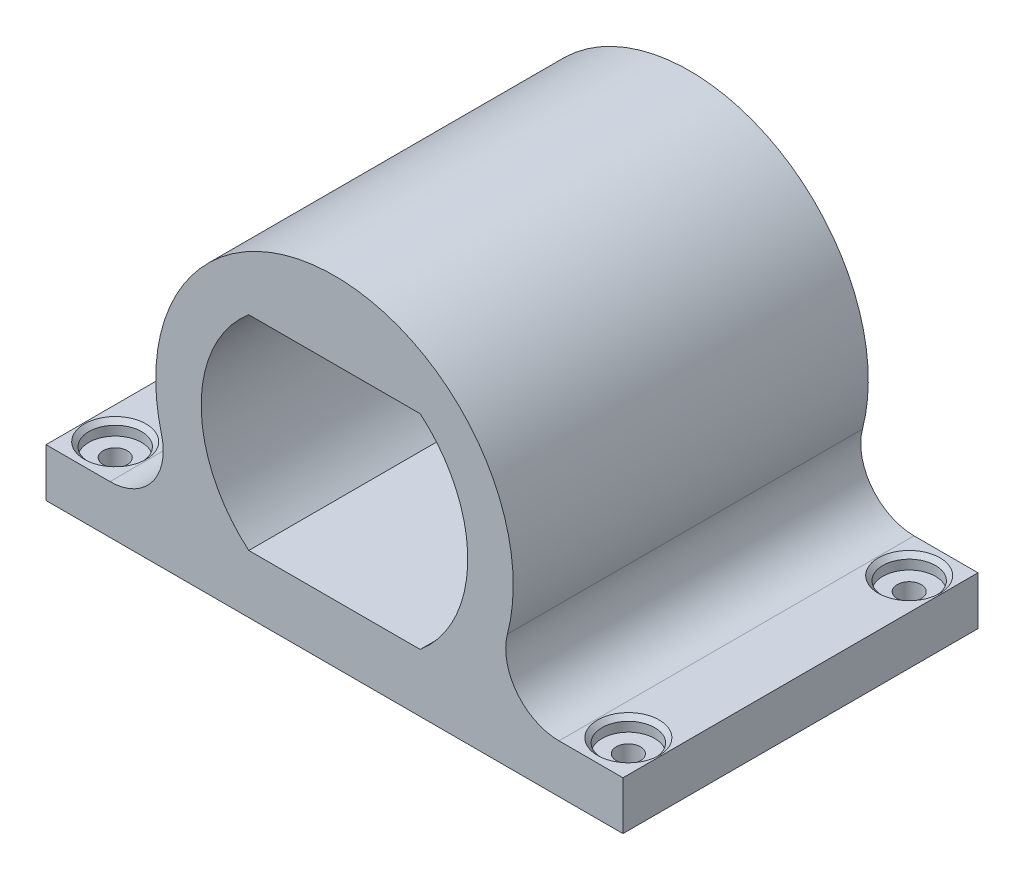
ISO-10303-21;
HEADER;
FILE_DESCRIPTION(('STEP AP214'),'2;1');
FILE_NAME('part.step','',(''),(''),'','','');
FILE_SCHEMA(('AUTOMOTIVE_DESIGN { 1 0 10303 214 1 1 1 1 }'));
ENDSEC;
DATA;
#1=APPLICATION_CONTEXT('core data for automotive mechanical design processes');
#2=APPLICATION_PROTOCOL_DEFINITION('international standard','automotive_design',2000,#1);
#3=PRODUCT_CONTEXT('',#1,'mechanical');
#4=PRODUCT('Part','Part','',(#3));
#5=PRODUCT_RELATED_PRODUCT_CATEGORY('part','',(#4));
#6=PRODUCT_DEFINITION_FORMATION('','',#4);
#7=PRODUCT_DEFINITION_CONTEXT('part definition',#1,'design');
#8=PRODUCT_DEFINITION('design','',#6,#7);
#9=PRODUCT_DEFINITION_SHAPE('','',#8);
#10=(LENGTH_UNIT() NAMED_UNIT(*) SI_UNIT(.MILLI.,.METRE.));
#11=(NAMED_UNIT(*) PLANE_ANGLE_UNIT() SI_UNIT($,.RADIAN.));
#12=(NAMED_UNIT(*) SI_UNIT($,.STERADIAN.) SOLID_ANGLE_UNIT());
#13=UNCERTAINTY_MEASURE_WITH_UNIT(LENGTH_MEASURE(1.E-05),#10,'distance_accuracy_value','');
#14=(GEOMETRIC_REPRESENTATION_CONTEXT(3) GLOBAL_UNCERTAINTY_ASSIGNED_CONTEXT((#13)) GLOBAL_UNIT_ASSIGNED_CONTEXT((#10,
#11,#12)) REPRESENTATION_CONTEXT('',''));
#15=CARTESIAN_POINT('',(0.,0.,0.));
#16=DIRECTION('',(0.,0.,1.));
#17=DIRECTION('',(1.,0.,0.));
#18=AXIS2_PLACEMENT_3D('',#15,#16,#17);
#19=CARTESIAN_POINT('',(-32.1204465765012,-8.38020267021273,50.8));
#20=DIRECTION('',(0.,0.,1.));
#21=DIRECTION('',(1.,0.,0.));
#22=AXIS2_PLACEMENT_3D('',#19,#20,#21);
#23=PLANE('',#22);
#24=CARTESIAN_POINT('',(-32.1204465765012,-8.38020267021273,50.8));
#25=DIRECTION('',(0.,0.,-1.));
#26=DIRECTION('',(1.,0.,0.));
#27=AXIS2_PLACEMENT_3D('',#24,#25,#26);
#28=CIRCLE('',#27,7.62);
#29=CARTESIAN_POINT('',(-24.7472565486679,-6.45654240564971,50.8));
#30=VERTEX_POINT('',#29);
#31=CARTESIAN_POINT('',(-32.1204465765012,-16.0002026702127,50.8));
#32=VERTEX_POINT('',#31);
#33=EDGE_CURVE('E162',#30,#32,#28,.T.);
#34=ORIENTED_EDGE('',*,*,#33,.T.);
#35=DIRECTION('',(-1.,0.,0.));
#36=VECTOR('',#35,1.);
#37=CARTESIAN_POINT('',(-41.275,-16.0002026702127,50.8));
#38=LINE('',#37,#36);
#39=CARTESIAN_POINT('',(-41.275,-16.0002026702127,50.8));
#40=VERTEX_POINT('',#39);
#41=EDGE_CURVE('E165',#32,#40,#38,.T.);
#42=ORIENTED_EDGE('',*,*,#41,.T.);
#43=DIRECTION('',(0.,-1.,0.));
#44=VECTOR('',#43,1.);
#45=CARTESIAN_POINT('',(-41.275,-22.9235,50.8));
#46=LINE('',#45,#44);
#47=CARTESIAN_POINT('',(-41.275,-22.9235,50.8));
#48=VERTEX_POINT('',#47);
#49=EDGE_CURVE('E168',#40,#48,#46,.T.);
#50=ORIENTED_EDGE('',*,*,#49,.T.);
#51=DIRECTION('',(1.,0.,0.));
#52=VECTOR('',#51,1.);
#53=CARTESIAN_POINT('',(41.275,-22.9235,50.8));
#54=LINE('',#53,#52);
#55=CARTESIAN_POINT('',(41.275,-22.9235,50.8));
#56=VERTEX_POINT('',#55);
#57=EDGE_CURVE('E170',#48,#56,#54,.T.);
#58=ORIENTED_EDGE('',*,*,#57,.T.);
#59=DIRECTION('',(0.,1.,0.));
#60=VECTOR('',#59,1.);
#61=CARTESIAN_POINT('',(41.275,-15.9999095174357,50.8));
#62=LINE('',#61,#60);
#63=CARTESIAN_POINT('',(41.275,-15.9999095174357,50.8));
#64=VERTEX_POINT('',#63);
#65=EDGE_CURVE('E172',#56,#64,#62,.T.);
#66=ORIENTED_EDGE('',*,*,#65,.T.);
#67=DIRECTION('',(-0.999999999487262,-3.20230458404112E-05,0.));
#68=VECTOR('',#67,1.);
#69=CARTESIAN_POINT('',(41.275,-15.9999095174357,50.8));
#70=LINE('',#69,#68);
#71=CARTESIAN_POINT('',(32.1206905921105,-16.0002026663057,50.8));
#72=VERTEX_POINT('',#71);
#73=EDGE_CURVE('E174',#64,#72,#70,.T.);
#74=ORIENTED_EDGE('',*,*,#73,.T.);
#75=CARTESIAN_POINT('',(32.1204465765012,-8.38020267021273,50.8));
#76=DIRECTION('',(0.,0.,-1.));
#77=DIRECTION('',(-1.,0.,0.));
#78=AXIS2_PLACEMENT_3D('',#75,#76,#77);
#79=CIRCLE('',#78,7.62);
#80=CARTESIAN_POINT('',(24.7472565486679,-6.45654240564969,50.8));
#81=VERTEX_POINT('',#80);
#82=EDGE_CURVE('E176',#72,#81,#79,.T.);
#83=ORIENTED_EDGE('',*,*,#82,.T.);
#84=CARTESIAN_POINT('',(0.,0.,50.8));
#85=DIRECTION('',(0.,0.,1.));
#86=DIRECTION('',(-1.,0.,0.));
#87=AXIS2_PLACEMENT_3D('',#84,#85,#86);
#88=CIRCLE('',#87,25.5756455738958);
#89=EDGE_CURVE('E178',#81,#30,#88,.T.);
#90=ORIENTED_EDGE('',*,*,#89,.T.);
#91=EDGE_LOOP('',(#34,#42,#50,#58,#66,#74,#83,#90));
#92=FACE_BOUND('',#91,.T.);
#93=DIRECTION('',(-1.,0.,0.));
#94=VECTOR('',#93,1.);
#95=CARTESIAN_POINT('',(0.,14.605,50.8));
#96=LINE('',#95,#94);
#97=CARTESIAN_POINT('',(12.2621960337946,14.605,50.8));
#98=VERTEX_POINT('',#97);
#99=CARTESIAN_POINT('',(-12.2621960337946,14.605,50.8));
#100=VERTEX_POINT('',#99);
#101=EDGE_CURVE('E132',#98,#100,#96,.T.);
#102=ORIENTED_EDGE('',*,*,#101,.F.);
#103=CARTESIAN_POINT('',(0.,0.,50.8));
#104=DIRECTION('',(0.,0.,1.));
#105=DIRECTION('',(-1.,0.,0.));
#106=AXIS2_PLACEMENT_3D('',#103,#104,#105);
#107=CIRCLE('',#106,19.0700675554967);
#108=CARTESIAN_POINT('',(12.2621960337946,-14.605,50.8));
#109=VERTEX_POINT('',#108);
#110=EDGE_CURVE('E124',#109,#98,#107,.T.);
#111=ORIENTED_EDGE('',*,*,#110,.F.);
#112=DIRECTION('',(1.,0.,0.));
#113=VECTOR('',#112,1.);
#114=CARTESIAN_POINT('',(0.,-14.605,50.8));
#115=LINE('',#114,#113);
#116=CARTESIAN_POINT('',(-12.2621960337946,-14.605,50.8));
#117=VERTEX_POINT('',#116);
#118=EDGE_CURVE('E146',#117,#109,#115,.T.);
#119=ORIENTED_EDGE('',*,*,#118,.F.);
#120=CARTESIAN_POINT('',(0.,0.,50.8));
#121=DIRECTION('',(0.,0.,1.));
#122=DIRECTION('',(1.,0.,0.));
#123=AXIS2_PLACEMENT_3D('',#120,#121,#122);
#124=CIRCLE('',#123,19.0700675554967);
#125=EDGE_CURVE('E144',#100,#117,#124,.T.);
#126=ORIENTED_EDGE('',*,*,#125,.F.);
#127=EDGE_LOOP('',(#102,#111,#119,#126));
#128=FACE_BOUND('',#127,.T.);
#129=ADVANCED_FACE('F33',(#92,#128),#23,.T.);
#130=CARTESIAN_POINT('',(-32.1204465765012,-8.38020267021273,0.));
#131=DIRECTION('',(0.,0.,1.));
#132=DIRECTION('',(1.,0.,0.));
#133=AXIS2_PLACEMENT_3D('',#130,#131,#132);
#134=PLANE('',#133);
#135=CARTESIAN_POINT('',(-32.1204465765012,-8.38020267021273,0.));
#136=DIRECTION('',(0.,0.,-1.));
#137=DIRECTION('',(1.,0.,0.));
#138=AXIS2_PLACEMENT_3D('',#135,#136,#137);
#139=CIRCLE('',#138,7.62);
#140=CARTESIAN_POINT('',(-24.7472565486679,-6.45654240564971,0.));
#141=VERTEX_POINT('',#140);
#142=CARTESIAN_POINT('',(-32.1204465765012,-16.0002026702127,0.));
#143=VERTEX_POINT('',#142);
#144=EDGE_CURVE('E140',#141,#143,#139,.T.);
#145=ORIENTED_EDGE('',*,*,#144,.F.);
#146=CARTESIAN_POINT('',(0.,0.,0.));
#147=DIRECTION('',(0.,0.,1.));
#148=DIRECTION('',(-1.,0.,0.));
#149=AXIS2_PLACEMENT_3D('',#146,#147,#148);
#150=CIRCLE('',#149,25.5756455738958);
#151=CARTESIAN_POINT('',(24.7472565486679,-6.45654240564969,0.));
#152=VERTEX_POINT('',#151);
#153=EDGE_CURVE('E166',#152,#141,#150,.T.);
#154=ORIENTED_EDGE('',*,*,#153,.F.);
#155=CARTESIAN_POINT('',(32.1204465765012,-8.38020267021273,0.));
#156=DIRECTION('',(0.,0.,-1.));
#157=DIRECTION('',(-1.,0.,0.));
#158=AXIS2_PLACEMENT_3D('',#155,#156,#157);
#159=CIRCLE('',#158,7.62);
#160=CARTESIAN_POINT('',(32.1206905921105,-16.0002026663057,0.));
#161=VERTEX_POINT('',#160);
#162=EDGE_CURVE('E193',#161,#152,#159,.T.);
#163=ORIENTED_EDGE('',*,*,#162,.F.);
#164=DIRECTION('',(-0.999999999487262,-3.20230458404112E-05,0.));
#165=VECTOR('',#164,1.);
#166=CARTESIAN_POINT('',(41.275,-15.9999095174357,0.));
#167=LINE('',#166,#165);
#168=CARTESIAN_POINT('',(41.275,-15.9999095174357,0.));
#169=VERTEX_POINT('',#168);
#170=EDGE_CURVE('E191',#169,#161,#167,.T.);
#171=ORIENTED_EDGE('',*,*,#170,.F.);
#172=DIRECTION('',(0.,1.,0.));
#173=VECTOR('',#172,1.);
#174=CARTESIAN_POINT('',(41.275,-15.9999095174357,0.));
#175=LINE('',#174,#173);
#176=CARTESIAN_POINT('',(41.275,-22.9235,0.));
#177=VERTEX_POINT('',#176);
#178=EDGE_CURVE('E189',#177,#169,#175,.T.);
#179=ORIENTED_EDGE('',*,*,#178,.F.);
#180=DIRECTION('',(1.,0.,0.));
#181=VECTOR('',#180,1.);
#182=CARTESIAN_POINT('',(41.275,-22.9235,0.));
#183=LINE('',#182,#181);
#184=CARTESIAN_POINT('',(-41.275,-22.9235,0.));
#185=VERTEX_POINT('',#184);
#186=EDGE_CURVE('E187',#185,#177,#183,.T.);
#187=ORIENTED_EDGE('',*,*,#186,.F.);
#188=DIRECTION('',(0.,-1.,0.));
#189=VECTOR('',#188,1.);
#190=CARTESIAN_POINT('',(-41.275,-22.9235,0.));
#191=LINE('',#190,#189);
#192=CARTESIAN_POINT('',(-41.275,-16.0002026702127,0.));
#193=VERTEX_POINT('',#192);
#194=EDGE_CURVE('E185',#193,#185,#191,.T.);
#195=ORIENTED_EDGE('',*,*,#194,.F.);
#196=DIRECTION('',(-1.,0.,0.));
#197=VECTOR('',#196,1.);
#198=CARTESIAN_POINT('',(-41.275,-16.0002026702127,0.));
#199=LINE('',#198,#197);
#200=EDGE_CURVE('E183',#143,#193,#199,.T.);
#201=ORIENTED_EDGE('',*,*,#200,.F.);
#202=EDGE_LOOP('',(#145,#154,#163,#171,#179,#187,#195,#201));
#203=FACE_BOUND('',#202,.T.);
#204=CARTESIAN_POINT('',(0.,0.,0.));
#205=DIRECTION('',(0.,0.,1.));
#206=DIRECTION('',(-1.,0.,0.));
#207=AXIS2_PLACEMENT_3D('',#204,#205,#206);
#208=CIRCLE('',#207,19.0700675554967);
#209=CARTESIAN_POINT('',(12.2621960337946,-14.605,0.));
#210=VERTEX_POINT('',#209);
#211=CARTESIAN_POINT('',(12.2621960337946,14.605,0.));
#212=VERTEX_POINT('',#211);
#213=EDGE_CURVE('E58',#210,#212,#208,.T.);
#214=ORIENTED_EDGE('',*,*,#213,.T.);
#215=DIRECTION('',(-1.,0.,0.));
#216=VECTOR('',#215,1.);
#217=CARTESIAN_POINT('',(0.,14.605,0.));
#218=LINE('',#217,#216);
#219=CARTESIAN_POINT('',(-12.2621960337946,14.605,0.));
#220=VERTEX_POINT('',#219);
#221=EDGE_CURVE('E139',#212,#220,#218,.T.);
#222=ORIENTED_EDGE('',*,*,#221,.T.);
#223=CARTESIAN_POINT('',(0.,0.,0.));
#224=DIRECTION('',(0.,0.,1.));
#225=DIRECTION('',(1.,0.,0.));
#226=AXIS2_PLACEMENT_3D('',#223,#224,#225);
#227=CIRCLE('',#226,19.0700675554967);
#228=CARTESIAN_POINT('',(-12.2621960337946,-14.605,0.));
#229=VERTEX_POINT('',#228);
#230=EDGE_CURVE('E154',#220,#229,#227,.T.);
#231=ORIENTED_EDGE('',*,*,#230,.T.);
#232=DIRECTION('',(1.,0.,0.));
#233=VECTOR('',#232,1.);
#234=CARTESIAN_POINT('',(0.,-14.605,0.));
#235=LINE('',#234,#233);
#236=EDGE_CURVE('E133',#229,#210,#235,.T.);
#237=ORIENTED_EDGE('',*,*,#236,.T.);
#238=EDGE_LOOP('',(#214,#222,#231,#237));
#239=FACE_BOUND('',#238,.T.);
#240=ADVANCED_FACE('F301',(#203,#239),#134,.F.);
#241=CARTESIAN_POINT('',(-32.1204465765012,-8.38020267021273,50.8));
#242=DIRECTION('',(0.,0.,-1.));
#243=DIRECTION('',(-1.,0.,0.));
#244=AXIS2_PLACEMENT_3D('',#241,#242,#243);
#245=CYLINDRICAL_SURFACE('',#244,7.62);
#246=ORIENTED_EDGE('',*,*,#144,.T.);
#247=DIRECTION('',(0.,0.,-1.));
#248=VECTOR('',#247,1.);
#249=CARTESIAN_POINT('',(-32.1204465765012,-16.0002026702127,50.8));
#250=LINE('',#249,#248);
#251=EDGE_CURVE('E11',#32,#143,#250,.T.);
#252=ORIENTED_EDGE('',*,*,#251,.F.);
#253=ORIENTED_EDGE('',*,*,#33,.F.);
#254=DIRECTION('',(0.,0.,-1.));
#255=VECTOR('',#254,1.);
#256=CARTESIAN_POINT('',(-24.7472565486679,-6.45654240564971,50.8));
#257=LINE('',#256,#255);
#258=EDGE_CURVE('E180',#30,#141,#257,.T.);
#259=ORIENTED_EDGE('',*,*,#258,.T.);
#260=EDGE_LOOP('',(#246,#252,#253,#259));
#261=FACE_BOUND('',#260,.T.);
#262=ADVANCED_FACE('F35',(#261),#245,.F.);
#263=CARTESIAN_POINT('',(-41.275,-16.0002026702127,50.8));
#264=DIRECTION('',(0.,-1.,0.));
#265=DIRECTION('',(0.,0.,-1.));
#266=AXIS2_PLACEMENT_3D('',#263,#264,#265);
#267=PLANE('',#266);
#268=CARTESIAN_POINT('',(-36.6977232882506,-16.0002026702127,5.28577815020981));
#269=DIRECTION('',(0.,1.,0.));
#270=DIRECTION('',(0.,0.,1.));
#271=AXIS2_PLACEMENT_3D('',#268,#269,#270);
#272=CIRCLE('',#271,4.40563);
#273=CARTESIAN_POINT('',(-36.6977232882506,-16.0002026702127,9.69140815020981));
#274=VERTEX_POINT('',#273);
#275=EDGE_CURVE('E216',#274,#274,#272,.T.);
#276=ORIENTED_EDGE('',*,*,#275,.F.);
#277=EDGE_LOOP('',(#276));
#278=FACE_BOUND('',#277,.T.);
#279=CARTESIAN_POINT('',(-36.6977232882506,-16.0002026702127,45.475658142152));
#280=DIRECTION('',(0.,1.,0.));
#281=DIRECTION('',(0.,0.,1.));
#282=AXIS2_PLACEMENT_3D('',#279,#280,#281);
#283=CIRCLE('',#282,4.40563);
#284=CARTESIAN_POINT('',(-36.6977232882506,-16.0002026702127,49.881288142152));
#285=VERTEX_POINT('',#284);
#286=EDGE_CURVE('E244',#285,#285,#283,.T.);
#287=ORIENTED_EDGE('',*,*,#286,.F.);
#288=EDGE_LOOP('',(#287));
#289=FACE_BOUND('',#288,.T.);
#290=ORIENTED_EDGE('',*,*,#200,.T.);
#291=DIRECTION('',(0.,0.,-1.));
#292=VECTOR('',#291,1.);
#293=CARTESIAN_POINT('',(-41.275,-16.0002026702127,50.8));
#294=LINE('',#293,#292);
#295=EDGE_CURVE('E42',#40,#193,#294,.T.);
#296=ORIENTED_EDGE('',*,*,#295,.F.);
#297=ORIENTED_EDGE('',*,*,#41,.F.);
#298=ORIENTED_EDGE('',*,*,#251,.T.);
#299=EDGE_LOOP('',(#290,#296,#297,#298));
#300=FACE_BOUND('',#299,.T.);
#301=ADVANCED_FACE('F287',(#278,#289,#300),#267,.F.);
#302=CARTESIAN_POINT('',(-41.275,-22.9235,50.8));
#303=DIRECTION('',(1.,0.,0.));
#304=DIRECTION('',(0.,0.,-1.));
#305=AXIS2_PLACEMENT_3D('',#302,#303,#304);
#306=PLANE('',#305);
#307=ORIENTED_EDGE('',*,*,#194,.T.);
#308=DIRECTION('',(0.,0.,-1.));
#309=VECTOR('',#308,1.);
#310=CARTESIAN_POINT('',(-41.275,-22.9235,50.8));
#311=LINE('',#310,#309);
#312=EDGE_CURVE('E210',#48,#185,#311,.T.);
#313=ORIENTED_EDGE('',*,*,#312,.F.);
#314=ORIENTED_EDGE('',*,*,#49,.F.);
#315=ORIENTED_EDGE('',*,*,#295,.T.);
#316=EDGE_LOOP('',(#307,#313,#314,#315));
#317=FACE_BOUND('',#316,.T.);
#318=ADVANCED_FACE('F290',(#317),#306,.F.);
#319=CARTESIAN_POINT('',(41.275,-22.9235,50.8));
#320=DIRECTION('',(0.,1.,0.));
#321=DIRECTION('',(-1.,0.,0.));
#322=AXIS2_PLACEMENT_3D('',#319,#320,#321);
#323=PLANE('',#322);
#324=CARTESIAN_POINT('',(36.698067005817,-22.9235,5.26803360924077));
#325=DIRECTION('',(0.,1.,0.));
#326=DIRECTION('',(-1.,0.,0.));
#327=AXIS2_PLACEMENT_3D('',#324,#325,#326);
#328=ELLIPSE('',#327,1.72720000088561,1.72720000000001);
#329=CARTESIAN_POINT('',(34.9708670049314,-22.9235,5.26803360924077));
#330=VERTEX_POINT('',#329);
#331=EDGE_CURVE('E37',#330,#330,#328,.T.);
#332=ORIENTED_EDGE('',*,*,#331,.T.);
#333=EDGE_LOOP('',(#332));
#334=FACE_BOUND('',#333,.T.);
#335=CARTESIAN_POINT('',(36.698067005817,-22.9235,45.4495160266788));
#336=DIRECTION('',(0.,1.,0.));
#337=DIRECTION('',(-1.,0.,0.));
#338=AXIS2_PLACEMENT_3D('',#335,#336,#337);
#339=ELLIPSE('',#338,1.72720000088561,1.72720000000001);
#340=CARTESIAN_POINT('',(34.9708670049314,-22.9235,45.4495160266788));
#341=VERTEX_POINT('',#340);
#342=EDGE_CURVE('E214',#341,#341,#339,.T.);
#343=ORIENTED_EDGE('',*,*,#342,.T.);
#344=EDGE_LOOP('',(#343));
#345=FACE_BOUND('',#344,.T.);
#346=CARTESIAN_POINT('',(-36.6977232882506,-22.9235,5.28577815020981));
#347=DIRECTION('',(0.,1.,0.));
#348=DIRECTION('',(0.,0.,1.));
#349=AXIS2_PLACEMENT_3D('',#346,#347,#348);
#350=CIRCLE('',#349,1.7272);
#351=CARTESIAN_POINT('',(-36.6977232882506,-22.9235,7.01297815020981));
#352=VERTEX_POINT('',#351);
#353=EDGE_CURVE('E241',#352,#352,#350,.T.);
#354=ORIENTED_EDGE('',*,*,#353,.T.);
#355=EDGE_LOOP('',(#354));
#356=FACE_BOUND('',#355,.T.);
#357=CARTESIAN_POINT('',(-36.6977232882506,-22.9235,45.475658142152));
#358=DIRECTION('',(0.,1.,0.));
#359=DIRECTION('',(0.,0.,1.));
#360=AXIS2_PLACEMENT_3D('',#357,#358,#359);
#361=CIRCLE('',#360,1.7272);
#362=CARTESIAN_POINT('',(-36.6977232882506,-22.9235,47.202858142152));
#363=VERTEX_POINT('',#362);
#364=EDGE_CURVE('E152',#363,#363,#361,.T.);
#365=ORIENTED_EDGE('',*,*,#364,.T.);
#366=EDGE_LOOP('',(#365));
#367=FACE_BOUND('',#366,.T.);
#368=ORIENTED_EDGE('',*,*,#186,.T.);
#369=DIRECTION('',(0.,0.,-1.));
#370=VECTOR('',#369,1.);
#371=CARTESIAN_POINT('',(41.275,-22.9235,50.8));
#372=LINE('',#371,#370);
#373=EDGE_CURVE('E207',#56,#177,#372,.T.);
#374=ORIENTED_EDGE('',*,*,#373,.F.);
#375=ORIENTED_EDGE('',*,*,#57,.F.);
#376=ORIENTED_EDGE('',*,*,#312,.T.);
#377=EDGE_LOOP('',(#368,#374,#375,#376));
#378=FACE_BOUND('',#377,.T.);
#379=ADVANCED_FACE('F258',(#334,#345,#356,#367,#378),#323,.F.);
#380=CARTESIAN_POINT('',(41.275,-15.9999095174357,50.8));
#381=DIRECTION('',(-1.,0.,0.));
#382=DIRECTION('',(0.,0.,1.));
#383=AXIS2_PLACEMENT_3D('',#380,#381,#382);
#384=PLANE('',#383);
#385=ORIENTED_EDGE('',*,*,#178,.T.);
#386=DIRECTION('',(0.,0.,-1.));
#387=VECTOR('',#386,1.);
#388=CARTESIAN_POINT('',(41.275,-15.9999095174357,50.8));
#389=LINE('',#388,#387);
#390=EDGE_CURVE('E204',#64,#169,#389,.T.);
#391=ORIENTED_EDGE('',*,*,#390,.F.);
#392=ORIENTED_EDGE('',*,*,#65,.F.);
#393=ORIENTED_EDGE('',*,*,#373,.T.);
#394=EDGE_LOOP('',(#385,#391,#392,#393));
#395=FACE_BOUND('',#394,.T.);
#396=ADVANCED_FACE('F309',(#395),#384,.F.);
#397=CARTESIAN_POINT('',(41.275,-15.9999095174357,50.8));
#398=DIRECTION('',(3.20230458404112E-05,-0.999999999487262,0.));
#399=DIRECTION('',(0.999999999487262,3.20230458404112E-05,0.));
#400=AXIS2_PLACEMENT_3D('',#397,#398,#399);
#401=PLANE('',#400);
#402=CARTESIAN_POINT('',(36.6978452960553,-16.0000560918707,5.26803360924077));
#403=DIRECTION('',(-3.20230458404112E-05,0.999999999487262,0.));
#404=DIRECTION('',(-0.999999999487262,-3.20230458404112E-05,0.));
#405=AXIS2_PLACEMENT_3D('',#402,#403,#404);
#406=CIRCLE('',#405,4.40563);
#407=CARTESIAN_POINT('',(32.2922152983142,-16.0001971735621,5.26803360924077));
#408=VERTEX_POINT('',#407);
#409=EDGE_CURVE('E416',#408,#408,#406,.T.);
#410=ORIENTED_EDGE('',*,*,#409,.F.);
#411=EDGE_LOOP('',(#410));
#412=FACE_BOUND('',#411,.T.);
#413=CARTESIAN_POINT('',(36.6978452960553,-16.0000560918707,45.4495160266788));
#414=DIRECTION('',(-3.20230458404112E-05,0.999999999487262,0.));
#415=DIRECTION('',(-0.999999999487262,-3.20230458404112E-05,0.));
#416=AXIS2_PLACEMENT_3D('',#413,#414,#415);
#417=CIRCLE('',#416,4.40563);
#418=CARTESIAN_POINT('',(32.2922152983142,-16.0001971735621,45.4495160266788));
#419=VERTEX_POINT('',#418);
#420=EDGE_CURVE('E426',#419,#419,#417,.T.);
#421=ORIENTED_EDGE('',*,*,#420,.F.);
#422=EDGE_LOOP('',(#421));
#423=FACE_BOUND('',#422,.T.);
#424=ORIENTED_EDGE('',*,*,#170,.T.);
#425=DIRECTION('',(0.,0.,-1.));
#426=VECTOR('',#425,1.);
#427=CARTESIAN_POINT('',(32.1206905921105,-16.0002026663057,50.8));
#428=LINE('',#427,#426);
#429=EDGE_CURVE('E201',#72,#161,#428,.T.);
#430=ORIENTED_EDGE('',*,*,#429,.F.);
#431=ORIENTED_EDGE('',*,*,#73,.F.);
#432=ORIENTED_EDGE('',*,*,#390,.T.);
#433=EDGE_LOOP('',(#424,#430,#431,#432));
#434=FACE_BOUND('',#433,.T.);
#435=ADVANCED_FACE('F327',(#412,#423,#434),#401,.F.);
#436=CARTESIAN_POINT('',(32.1204465765012,-8.38020267021273,50.8));
#437=DIRECTION('',(0.,0.,-1.));
#438=DIRECTION('',(-1.,0.,0.));
#439=AXIS2_PLACEMENT_3D('',#436,#437,#438);
#440=CYLINDRICAL_SURFACE('',#439,7.62);
#441=ORIENTED_EDGE('',*,*,#162,.T.);
#442=DIRECTION('',(0.,0.,-1.));
#443=VECTOR('',#442,1.);
#444=CARTESIAN_POINT('',(24.7472565486679,-6.45654240564969,50.8));
#445=LINE('',#444,#443);
#446=EDGE_CURVE('E198',#81,#152,#445,.T.);
#447=ORIENTED_EDGE('',*,*,#446,.F.);
#448=ORIENTED_EDGE('',*,*,#82,.F.);
#449=ORIENTED_EDGE('',*,*,#429,.T.);
#450=EDGE_LOOP('',(#441,#447,#448,#449));
#451=FACE_BOUND('',#450,.T.);
#452=ADVANCED_FACE('F325',(#451),#440,.F.);
#453=CARTESIAN_POINT('',(0.,0.,50.8));
#454=DIRECTION('',(0.,0.,-1.));
#455=DIRECTION('',(-1.,0.,0.));
#456=AXIS2_PLACEMENT_3D('',#453,#454,#455);
#457=CYLINDRICAL_SURFACE('',#456,25.5756455738958);
#458=ORIENTED_EDGE('',*,*,#153,.T.);
#459=ORIENTED_EDGE('',*,*,#258,.F.);
#460=ORIENTED_EDGE('',*,*,#89,.F.);
#461=ORIENTED_EDGE('',*,*,#446,.T.);
#462=EDGE_LOOP('',(#458,#459,#460,#461));
#463=FACE_BOUND('',#462,.T.);
#464=ADVANCED_FACE('F321',(#463),#457,.T.);
#465=CARTESIAN_POINT('',(0.,0.,50.8));
#466=DIRECTION('',(0.,0.,-1.));
#467=DIRECTION('',(-1.,0.,0.));
#468=AXIS2_PLACEMENT_3D('',#465,#466,#467);
#469=CYLINDRICAL_SURFACE('',#468,19.0700675554967);
#470=ORIENTED_EDGE('',*,*,#213,.F.);
#471=DIRECTION('',(0.,0.,-1.));
#472=VECTOR('',#471,1.);
#473=CARTESIAN_POINT('',(12.2621960337946,-14.605,50.8));
#474=LINE('',#473,#472);
#475=EDGE_CURVE('E128',#109,#210,#474,.T.);
#476=ORIENTED_EDGE('',*,*,#475,.F.);
#477=ORIENTED_EDGE('',*,*,#110,.T.);
#478=DIRECTION('',(0.,0.,-1.));
#479=VECTOR('',#478,1.);
#480=CARTESIAN_POINT('',(12.2621960337946,14.605,50.8));
#481=LINE('',#480,#479);
#482=EDGE_CURVE('E127',#98,#212,#481,.T.);
#483=ORIENTED_EDGE('',*,*,#482,.T.);
#484=EDGE_LOOP('',(#470,#476,#477,#483));
#485=FACE_BOUND('',#484,.T.);
#486=ADVANCED_FACE('F126',(#485),#469,.F.);
#487=CARTESIAN_POINT('',(0.,14.605,50.8));
#488=DIRECTION('',(0.,-1.,0.));
#489=DIRECTION('',(0.,0.,-1.));
#490=AXIS2_PLACEMENT_3D('',#487,#488,#489);
#491=PLANE('',#490);
#492=ORIENTED_EDGE('',*,*,#221,.F.);
#493=ORIENTED_EDGE('',*,*,#482,.F.);
#494=ORIENTED_EDGE('',*,*,#101,.T.);
#495=DIRECTION('',(0.,0.,-1.));
#496=VECTOR('',#495,1.);
#497=CARTESIAN_POINT('',(-12.2621960337946,14.605,50.8));
#498=LINE('',#497,#496);
#499=EDGE_CURVE('E141',#100,#220,#498,.T.);
#500=ORIENTED_EDGE('',*,*,#499,.T.);
#501=EDGE_LOOP('',(#492,#493,#494,#500));
#502=FACE_BOUND('',#501,.T.);
#503=ADVANCED_FACE('F136',(#502),#491,.T.);
#504=CARTESIAN_POINT('',(0.,0.,50.8));
#505=DIRECTION('',(0.,0.,-1.));
#506=DIRECTION('',(-1.,0.,0.));
#507=AXIS2_PLACEMENT_3D('',#504,#505,#506);
#508=CYLINDRICAL_SURFACE('',#507,19.0700675554967);
#509=ORIENTED_EDGE('',*,*,#230,.F.);
#510=ORIENTED_EDGE('',*,*,#499,.F.);
#511=ORIENTED_EDGE('',*,*,#125,.T.);
#512=DIRECTION('',(0.,0.,-1.));
#513=VECTOR('',#512,1.);
#514=CARTESIAN_POINT('',(-12.2621960337946,-14.605,50.8));
#515=LINE('',#514,#513);
#516=EDGE_CURVE('E50',#117,#229,#515,.T.);
#517=ORIENTED_EDGE('',*,*,#516,.T.);
#518=EDGE_LOOP('',(#509,#510,#511,#517));
#519=FACE_BOUND('',#518,.T.);
#520=ADVANCED_FACE('F355',(#519),#508,.F.);
#521=CARTESIAN_POINT('',(0.,-14.605,50.8));
#522=DIRECTION('',(0.,1.,0.));
#523=DIRECTION('',(0.,0.,1.));
#524=AXIS2_PLACEMENT_3D('',#521,#522,#523);
#525=PLANE('',#524);
#526=ORIENTED_EDGE('',*,*,#236,.F.);
#527=ORIENTED_EDGE('',*,*,#516,.F.);
#528=ORIENTED_EDGE('',*,*,#118,.T.);
#529=ORIENTED_EDGE('',*,*,#475,.T.);
#530=EDGE_LOOP('',(#526,#527,#528,#529));
#531=FACE_BOUND('',#530,.T.);
#532=ADVANCED_FACE('F265',(#531),#525,.T.);
#533=CARTESIAN_POINT('',(-36.6977232882506,-16.0002026702127,45.475658142152));
#534=DIRECTION('',(0.,1.,0.));
#535=DIRECTION('',(0.,0.,1.));
#536=AXIS2_PLACEMENT_3D('',#533,#534,#535);
#537=CYLINDRICAL_SURFACE('',#536,1.7272);
#538=ORIENTED_EDGE('',*,*,#364,.F.);
#539=EDGE_LOOP('',(#538));
#540=FACE_BOUND('',#539,.T.);
#541=CARTESIAN_POINT('',(-36.6977232882506,-17.9814026702127,45.475658142152));
#542=DIRECTION('',(0.,1.,0.));
#543=DIRECTION('',(0.,0.,1.));
#544=AXIS2_PLACEMENT_3D('',#541,#542,#543);
#545=CIRCLE('',#544,1.7272);
#546=CARTESIAN_POINT('',(-36.6977232882506,-17.9814026702127,47.202858142152));
#547=VERTEX_POINT('',#546);
#548=EDGE_CURVE('E253',#547,#547,#545,.T.);
#549=ORIENTED_EDGE('',*,*,#548,.T.);
#550=EDGE_LOOP('',(#549));
#551=FACE_BOUND('',#550,.T.);
#552=ADVANCED_FACE('F261',(#540,#551),#537,.F.);
#553=CARTESIAN_POINT('',(-32.9270932882506,-17.9814026702127,45.475658142152));
#554=DIRECTION('',(0.,-1.,0.));
#555=DIRECTION('',(0.,0.,-1.));
#556=AXIS2_PLACEMENT_3D('',#553,#554,#555);
#557=PLANE('',#556);
#558=ORIENTED_EDGE('',*,*,#548,.F.);
#559=EDGE_LOOP('',(#558));
#560=FACE_BOUND('',#559,.T.);
#561=CARTESIAN_POINT('',(-36.6977232882506,-17.9814026702127,45.475658142152));
#562=DIRECTION('',(0.,1.,0.));
#563=DIRECTION('',(0.,0.,1.));
#564=AXIS2_PLACEMENT_3D('',#561,#562,#563);
#565=CIRCLE('',#564,3.77063);
#566=CARTESIAN_POINT('',(-36.6977232882506,-17.9814026702127,49.246288142152));
#567=VERTEX_POINT('',#566);
#568=EDGE_CURVE('E250',#567,#567,#565,.T.);
#569=ORIENTED_EDGE('',*,*,#568,.T.);
#570=EDGE_LOOP('',(#569));
#571=FACE_BOUND('',#570,.T.);
#572=ADVANCED_FACE('F264',(#560,#571),#557,.F.);
#573=CARTESIAN_POINT('',(-36.6977232882506,-16.0002026702127,45.475658142152));
#574=DIRECTION('',(0.,1.,0.));
#575=DIRECTION('',(0.,0.,1.));
#576=AXIS2_PLACEMENT_3D('',#573,#574,#575);
#577=CYLINDRICAL_SURFACE('',#576,3.77063);
#578=ORIENTED_EDGE('',*,*,#568,.F.);
#579=EDGE_LOOP('',(#578));
#580=FACE_BOUND('',#579,.T.);
#581=CARTESIAN_POINT('',(-36.6977232882506,-16.6352026702127,45.475658142152));
#582=DIRECTION('',(0.,1.,0.));
#583=DIRECTION('',(0.,0.,1.));
#584=AXIS2_PLACEMENT_3D('',#581,#582,#583);
#585=CIRCLE('',#584,3.77063);
#586=CARTESIAN_POINT('',(-36.6977232882506,-16.6352026702127,49.246288142152));
#587=VERTEX_POINT('',#586);
#588=EDGE_CURVE('E247',#587,#587,#585,.T.);
#589=ORIENTED_EDGE('',*,*,#588,.T.);
#590=EDGE_LOOP('',(#589));
#591=FACE_BOUND('',#590,.T.);
#592=ADVANCED_FACE('F271',(#580,#591),#577,.F.);
#593=CARTESIAN_POINT('',(-36.6977232882506,-16.0002026702127,45.475658142152));
#594=DIRECTION('',(0.,1.,0.));
#595=DIRECTION('',(0.,0.,1.));
#596=AXIS2_PLACEMENT_3D('',#593,#594,#595);
#597=CONICAL_SURFACE('',#596,4.40563,0.785398163397451);
#598=ORIENTED_EDGE('',*,*,#588,.F.);
#599=EDGE_LOOP('',(#598));
#600=FACE_BOUND('',#599,.T.);
#601=ORIENTED_EDGE('',*,*,#286,.T.);
#602=EDGE_LOOP('',(#601));
#603=FACE_BOUND('',#602,.T.);
#604=ADVANCED_FACE('F277',(#600,#603),#597,.F.);
#605=CARTESIAN_POINT('',(-36.6977232882506,-16.0002026702127,5.28577815020981));
#606=DIRECTION('',(0.,1.,0.));
#607=DIRECTION('',(0.,0.,1.));
#608=AXIS2_PLACEMENT_3D('',#605,#606,#607);
#609=CYLINDRICAL_SURFACE('',#608,1.7272);
#610=ORIENTED_EDGE('',*,*,#353,.F.);
#611=EDGE_LOOP('',(#610));
#612=FACE_BOUND('',#611,.T.);
#613=CARTESIAN_POINT('',(-36.6977232882506,-17.9814026702127,5.28577815020981));
#614=DIRECTION('',(0.,1.,0.));
#615=DIRECTION('',(0.,0.,1.));
#616=AXIS2_PLACEMENT_3D('',#613,#614,#615);
#617=CIRCLE('',#616,1.7272);
#618=CARTESIAN_POINT('',(-36.6977232882506,-17.9814026702127,7.01297815020981));
#619=VERTEX_POINT('',#618);
#620=EDGE_CURVE('E238',#619,#619,#617,.T.);
#621=ORIENTED_EDGE('',*,*,#620,.T.);
#622=EDGE_LOOP('',(#621));
#623=FACE_BOUND('',#622,.T.);
#624=ADVANCED_FACE('F283',(#612,#623),#609,.F.);
#625=CARTESIAN_POINT('',(-32.9270932882506,-17.9814026702127,5.28577815020981));
#626=DIRECTION('',(0.,-1.,0.));
#627=DIRECTION('',(0.,0.,-1.));
#628=AXIS2_PLACEMENT_3D('',#625,#626,#627);
#629=PLANE('',#628);
#630=ORIENTED_EDGE('',*,*,#620,.F.);
#631=EDGE_LOOP('',(#630));
#632=FACE_BOUND('',#631,.T.);
#633=CARTESIAN_POINT('',(-36.6977232882506,-17.9814026702127,5.28577815020981));
#634=DIRECTION('',(0.,1.,0.));
#635=DIRECTION('',(0.,0.,1.));
#636=AXIS2_PLACEMENT_3D('',#633,#634,#635);
#637=CIRCLE('',#636,3.77063);
#638=CARTESIAN_POINT('',(-36.6977232882506,-17.9814026702127,9.0564081502098));
#639=VERTEX_POINT('',#638);
#640=EDGE_CURVE('E235',#639,#639,#637,.T.);
#641=ORIENTED_EDGE('',*,*,#640,.T.);
#642=EDGE_LOOP('',(#641));
#643=FACE_BOUND('',#642,.T.);
#644=ADVANCED_FACE('F366',(#632,#643),#629,.F.);
#645=CARTESIAN_POINT('',(-36.6977232882506,-16.0002026702127,5.28577815020981));
#646=DIRECTION('',(0.,1.,0.));
#647=DIRECTION('',(0.,0.,1.));
#648=AXIS2_PLACEMENT_3D('',#645,#646,#647);
#649=CYLINDRICAL_SURFACE('',#648,3.77063);
#650=ORIENTED_EDGE('',*,*,#640,.F.);
#651=EDGE_LOOP('',(#650));
#652=FACE_BOUND('',#651,.T.);
#653=CARTESIAN_POINT('',(-36.6977232882506,-16.6352026702127,5.28577815020981));
#654=DIRECTION('',(0.,1.,0.));
#655=DIRECTION('',(0.,0.,1.));
#656=AXIS2_PLACEMENT_3D('',#653,#654,#655);
#657=CIRCLE('',#656,3.77063);
#658=CARTESIAN_POINT('',(-36.6977232882506,-16.6352026702127,9.0564081502098));
#659=VERTEX_POINT('',#658);
#660=EDGE_CURVE('E221',#659,#659,#657,.T.);
#661=ORIENTED_EDGE('',*,*,#660,.T.);
#662=EDGE_LOOP('',(#661));
#663=FACE_BOUND('',#662,.T.);
#664=ADVANCED_FACE('F370',(#652,#663),#649,.F.);
#665=CARTESIAN_POINT('',(-36.6977232882506,-16.0002026702127,5.28577815020981));
#666=DIRECTION('',(0.,1.,0.));
#667=DIRECTION('',(0.,0.,1.));
#668=AXIS2_PLACEMENT_3D('',#665,#666,#667);
#669=CONICAL_SURFACE('',#668,4.40563,0.785398163397451);
#670=ORIENTED_EDGE('',*,*,#660,.F.);
#671=EDGE_LOOP('',(#670));
#672=FACE_BOUND('',#671,.T.);
#673=ORIENTED_EDGE('',*,*,#275,.T.);
#674=EDGE_LOOP('',(#673));
#675=FACE_BOUND('',#674,.T.);
#676=ADVANCED_FACE('F374',(#672,#675),#669,.F.);
#677=CARTESIAN_POINT('',(36.6978452960553,-16.0000560918707,45.4495160266788));
#678=DIRECTION('',(-3.20230458404112E-05,0.999999999487262,0.));
#679=DIRECTION('',(-0.999999999487262,-3.20230458404112E-05,0.));
#680=AXIS2_PLACEMENT_3D('',#677,#678,#679);
#681=CYLINDRICAL_SURFACE('',#680,1.72720000000001);
#682=CARTESIAN_POINT('',(36.6979087401137,-17.9812560908549,45.4495160266788));
#683=DIRECTION('',(-3.20230458404112E-05,0.999999999487262,0.));
#684=DIRECTION('',(-0.999999999487262,-3.20230458404112E-05,0.));
#685=AXIS2_PLACEMENT_3D('',#682,#683,#684);
#686=CIRCLE('',#685,1.72720000000001);
#687=CARTESIAN_POINT('',(34.9707087409993,-17.9813114010596,45.4495160266788));
#688=VERTEX_POINT('',#687);
#689=EDGE_CURVE('E217',#688,#688,#686,.T.);
#690=ORIENTED_EDGE('',*,*,#689,.T.);
#691=EDGE_LOOP('',(#690));
#692=FACE_BOUND('',#691,.T.);
#693=ORIENTED_EDGE('',*,*,#342,.F.);
#694=EDGE_LOOP('',(#693));
#695=FACE_BOUND('',#694,.T.);
#696=ADVANCED_FACE('F378',(#692,#695),#681,.F.);
#697=CARTESIAN_POINT('',(36.6979087401137,-17.9812560908549,49.2201460266788));
#698=DIRECTION('',(3.20230458404112E-05,-0.999999999487262,0.));
#699=DIRECTION('',(0.999999999487262,3.20230458404112E-05,0.));
#700=AXIS2_PLACEMENT_3D('',#697,#698,#699);
#701=PLANE('',#700);
#702=ORIENTED_EDGE('',*,*,#689,.F.);
#703=EDGE_LOOP('',(#702));
#704=FACE_BOUND('',#703,.T.);
#705=CARTESIAN_POINT('',(36.6979087401137,-17.9812560908549,45.4495160266788));
#706=DIRECTION('',(-3.20230458404112E-05,0.999999999487262,0.));
#707=DIRECTION('',(-0.999999999487262,-3.20230458404112E-05,0.));
#708=AXIS2_PLACEMENT_3D('',#705,#706,#707);
#709=CIRCLE('',#708,3.77063);
#710=CARTESIAN_POINT('',(32.927278742047,-17.9813768379122,45.4495160266788));
#711=VERTEX_POINT('',#710);
#712=EDGE_CURVE('E224',#711,#711,#709,.T.);
#713=ORIENTED_EDGE('',*,*,#712,.T.);
#714=EDGE_LOOP('',(#713));
#715=FACE_BOUND('',#714,.T.);
#716=ADVANCED_FACE('F382',(#704,#715),#701,.F.);
#717=CARTESIAN_POINT('',(36.6978452960553,-16.0000560918707,45.4495160266788));
#718=DIRECTION('',(-3.20230458404112E-05,0.999999999487262,0.));
#719=DIRECTION('',(-0.999999999487262,-3.20230458404112E-05,0.));
#720=AXIS2_PLACEMENT_3D('',#717,#718,#719);
#721=CYLINDRICAL_SURFACE('',#720,3.77063);
#722=ORIENTED_EDGE('',*,*,#712,.F.);
#723=EDGE_LOOP('',(#722));
#724=FACE_BOUND('',#723,.T.);
#725=CARTESIAN_POINT('',(36.6978656306894,-16.6350560915451,45.4495160266788));
#726=DIRECTION('',(-3.20230458404112E-05,0.999999999487262,0.));
#727=DIRECTION('',(-0.999999999487262,-3.20230458404112E-05,0.));
#728=AXIS2_PLACEMENT_3D('',#725,#726,#727);
#729=CIRCLE('',#728,3.77063);
#730=CARTESIAN_POINT('',(32.9272356326227,-16.6351768386025,45.4495160266788));
#731=VERTEX_POINT('',#730);
#732=EDGE_CURVE('E229',#731,#731,#729,.T.);
#733=ORIENTED_EDGE('',*,*,#732,.T.);
#734=EDGE_LOOP('',(#733));
#735=FACE_BOUND('',#734,.T.);
#736=ADVANCED_FACE('F385',(#724,#735),#721,.F.);
#737=CARTESIAN_POINT('',(36.6978452960553,-16.0000560918707,45.4495160266788));
#738=DIRECTION('',(-3.20230458404112E-05,0.999999999487262,0.));
#739=DIRECTION('',(-0.999999999487262,-3.20230458404112E-05,0.));
#740=AXIS2_PLACEMENT_3D('',#737,#738,#739);
#741=CONICAL_SURFACE('',#740,4.40563,0.785398163397447);
#742=ORIENTED_EDGE('',*,*,#732,.F.);
#743=EDGE_LOOP('',(#742));
#744=FACE_BOUND('',#743,.T.);
#745=ORIENTED_EDGE('',*,*,#420,.T.);
#746=EDGE_LOOP('',(#745));
#747=FACE_BOUND('',#746,.T.);
#748=ADVANCED_FACE('F389',(#744,#747),#741,.F.);
#749=CARTESIAN_POINT('',(36.6978452960553,-16.0000560918707,5.26803360924077));
#750=DIRECTION('',(-3.20230458404112E-05,0.999999999487262,0.));
#751=DIRECTION('',(-0.999999999487262,-3.20230458404112E-05,0.));
#752=AXIS2_PLACEMENT_3D('',#749,#750,#751);
#753=CYLINDRICAL_SURFACE('',#752,1.72720000000001);
#754=CARTESIAN_POINT('',(36.6979087401137,-17.9812560908549,5.26803360924077));
#755=DIRECTION('',(-3.20230458404112E-05,0.999999999487262,0.));
#756=DIRECTION('',(-0.999999999487262,-3.20230458404112E-05,0.));
#757=AXIS2_PLACEMENT_3D('',#754,#755,#756);
#758=CIRCLE('',#757,1.72720000000002);
#759=CARTESIAN_POINT('',(34.9707087409993,-17.9813114010596,5.26803360924077));
#760=VERTEX_POINT('',#759);
#761=EDGE_CURVE('E423',#760,#760,#758,.T.);
#762=ORIENTED_EDGE('',*,*,#761,.T.);
#763=EDGE_LOOP('',(#762));
#764=FACE_BOUND('',#763,.T.);
#765=ORIENTED_EDGE('',*,*,#331,.F.);
#766=EDGE_LOOP('',(#765));
#767=FACE_BOUND('',#766,.T.);
#768=ADVANCED_FACE('F393',(#764,#767),#753,.F.);
#769=CARTESIAN_POINT('',(36.6979087401137,-17.9812560908549,9.03866360924077));
#770=DIRECTION('',(3.20230458404112E-05,-0.999999999487262,0.));
#771=DIRECTION('',(0.999999999487262,3.20230458404112E-05,0.));
#772=AXIS2_PLACEMENT_3D('',#769,#770,#771);
#773=PLANE('',#772);
#774=ORIENTED_EDGE('',*,*,#761,.F.);
#775=EDGE_LOOP('',(#774));
#776=FACE_BOUND('',#775,.T.);
#777=CARTESIAN_POINT('',(36.6979087401137,-17.9812560908549,5.26803360924077));
#778=DIRECTION('',(-3.20230458404112E-05,0.999999999487262,0.));
#779=DIRECTION('',(-0.999999999487262,-3.20230458404112E-05,0.));
#780=AXIS2_PLACEMENT_3D('',#777,#778,#779);
#781=CIRCLE('',#780,3.77062999999999);
#782=CARTESIAN_POINT('',(32.927278742047,-17.9813768379122,5.26803360924077));
#783=VERTEX_POINT('',#782);
#784=EDGE_CURVE('E418',#783,#783,#781,.T.);
#785=ORIENTED_EDGE('',*,*,#784,.T.);
#786=EDGE_LOOP('',(#785));
#787=FACE_BOUND('',#786,.T.);
#788=ADVANCED_FACE('F397',(#776,#787),#773,.F.);
#789=CARTESIAN_POINT('',(36.6978452960553,-16.0000560918707,5.26803360924077));
#790=DIRECTION('',(-3.20230458404112E-05,0.999999999487262,0.));
#791=DIRECTION('',(-0.999999999487262,-3.20230458404112E-05,0.));
#792=AXIS2_PLACEMENT_3D('',#789,#790,#791);
#793=CYLINDRICAL_SURFACE('',#792,3.77062999999999);
#794=ORIENTED_EDGE('',*,*,#784,.F.);
#795=EDGE_LOOP('',(#794));
#796=FACE_BOUND('',#795,.T.);
#797=CARTESIAN_POINT('',(36.6978656306894,-16.6350560915451,5.26803360924077));
#798=DIRECTION('',(-3.20230458404112E-05,0.999999999487262,0.));
#799=DIRECTION('',(-0.999999999487262,-3.20230458404112E-05,0.));
#800=AXIS2_PLACEMENT_3D('',#797,#798,#799);
#801=CIRCLE('',#800,3.77062999999999);
#802=CARTESIAN_POINT('',(32.9272356326227,-16.6351768386025,5.26803360924077));
#803=VERTEX_POINT('',#802);
#804=EDGE_CURVE('E414',#803,#803,#801,.T.);
#805=ORIENTED_EDGE('',*,*,#804,.T.);
#806=EDGE_LOOP('',(#805));
#807=FACE_BOUND('',#806,.T.);
#808=ADVANCED_FACE('F401',(#796,#807),#793,.F.);
#809=CARTESIAN_POINT('',(36.6978452960553,-16.0000560918707,5.26803360924077));
#810=DIRECTION('',(-3.20230458404112E-05,0.999999999487262,0.));
#811=DIRECTION('',(-0.999999999487262,-3.20230458404112E-05,0.));
#812=AXIS2_PLACEMENT_3D('',#809,#810,#811);
#813=CONICAL_SURFACE('',#812,4.40563,0.78539816339745);
#814=ORIENTED_EDGE('',*,*,#804,.F.);
#815=EDGE_LOOP('',(#814));
#816=FACE_BOUND('',#815,.T.);
#817=ORIENTED_EDGE('',*,*,#409,.T.);
#818=EDGE_LOOP('',(#817));
#819=FACE_BOUND('',#818,.T.);
#820=ADVANCED_FACE('F405',(#816,#819),#813,.F.);
#821=CLOSED_SHELL('',(#129,#240,#262,#301,#318,#379,#396,#435,#452,#464,#486,#503,#520,#532,
#552,#572,#592,#604,#624,#644,#664,#676,#696,#716,#736,#748,#768,#788,#808,#820));
#822=MANIFOLD_SOLID_BREP('B2',#821);
#823=ADVANCED_BREP_SHAPE_REPRESENTATION('',(#18,#822),#14);
#824=SHAPE_DEFINITION_REPRESENTATION(#9,#823);
ENDSEC;
END-ISO-10303-21;
